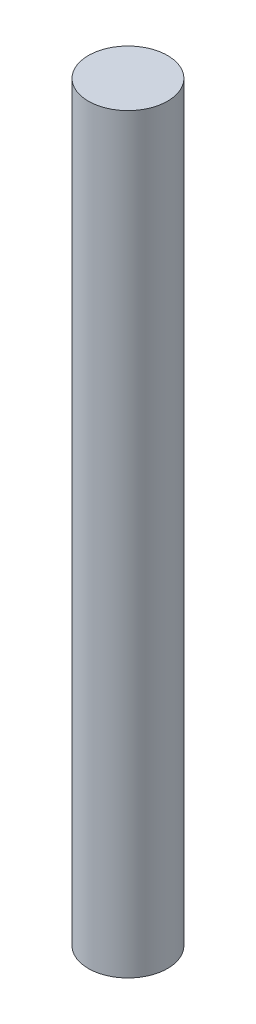
ISO-10303-21;
HEADER;
FILE_DESCRIPTION(('STEP AP214'),'2;1');
FILE_NAME('part.step','',(''),(''),'','','');
FILE_SCHEMA(('AUTOMOTIVE_DESIGN { 1 0 10303 214 1 1 1 1 }'));
ENDSEC;
DATA;
#1=APPLICATION_CONTEXT('core data for automotive mechanical design processes');
#2=APPLICATION_PROTOCOL_DEFINITION('international standard','automotive_design',2000,#1);
#3=PRODUCT_CONTEXT('',#1,'mechanical');
#4=PRODUCT('Part','Part','',(#3));
#5=PRODUCT_RELATED_PRODUCT_CATEGORY('part','',(#4));
#6=PRODUCT_DEFINITION_FORMATION('','',#4);
#7=PRODUCT_DEFINITION_CONTEXT('part definition',#1,'design');
#8=PRODUCT_DEFINITION('design','',#6,#7);
#9=PRODUCT_DEFINITION_SHAPE('','',#8);
#10=(LENGTH_UNIT() NAMED_UNIT(*) SI_UNIT(.MILLI.,.METRE.));
#11=(NAMED_UNIT(*) PLANE_ANGLE_UNIT() SI_UNIT($,.RADIAN.));
#12=(NAMED_UNIT(*) SI_UNIT($,.STERADIAN.) SOLID_ANGLE_UNIT());
#13=UNCERTAINTY_MEASURE_WITH_UNIT(LENGTH_MEASURE(1.E-05),#10,'distance_accuracy_value','');
#14=(GEOMETRIC_REPRESENTATION_CONTEXT(3) GLOBAL_UNCERTAINTY_ASSIGNED_CONTEXT((#13)) GLOBAL_UNIT_ASSIGNED_CONTEXT((#10,
#11,#12)) REPRESENTATION_CONTEXT('',''));
#15=CARTESIAN_POINT('',(0.,0.,0.));
#16=DIRECTION('',(0.,0.,1.));
#17=DIRECTION('',(1.,0.,0.));
#18=AXIS2_PLACEMENT_3D('',#15,#16,#17);
#19=CARTESIAN_POINT('',(0.,37.,0.));
#20=DIRECTION('',(0.,-1.,0.));
#21=DIRECTION('',(0.,0.,-1.));
#22=AXIS2_PLACEMENT_3D('',#19,#20,#21);
#23=CYLINDRICAL_SURFACE('',#22,1.95);
#24=CARTESIAN_POINT('',(0.,37.,0.));
#25=DIRECTION('',(0.,1.,0.));
#26=DIRECTION('',(0.,0.,1.));
#27=AXIS2_PLACEMENT_3D('',#24,#25,#26);
#28=CIRCLE('',#27,1.95);
#29=CARTESIAN_POINT('',(0.,37.,1.95));
#30=VERTEX_POINT('',#29);
#31=EDGE_CURVE('E10',#30,#30,#28,.T.);
#32=ORIENTED_EDGE('',*,*,#31,.F.);
#33=EDGE_LOOP('',(#32));
#34=FACE_BOUND('',#33,.T.);
#35=CARTESIAN_POINT('',(0.,0.,0.));
#36=DIRECTION('',(0.,1.,0.));
#37=DIRECTION('',(0.,0.,1.));
#38=AXIS2_PLACEMENT_3D('',#35,#36,#37);
#39=CIRCLE('',#38,1.95);
#40=CARTESIAN_POINT('',(0.,0.,1.95));
#41=VERTEX_POINT('',#40);
#42=EDGE_CURVE('E43',#41,#41,#39,.T.);
#43=ORIENTED_EDGE('',*,*,#42,.T.);
#44=EDGE_LOOP('',(#43));
#45=FACE_BOUND('',#44,.T.);
#46=ADVANCED_FACE('F40',(#34,#45),#23,.T.);
#47=CARTESIAN_POINT('',(0.,37.,0.));
#48=DIRECTION('',(0.,1.,0.));
#49=DIRECTION('',(0.,0.,1.));
#50=AXIS2_PLACEMENT_3D('',#47,#48,#49);
#51=PLANE('',#50);
#52=ORIENTED_EDGE('',*,*,#31,.T.);
#53=EDGE_LOOP('',(#52));
#54=FACE_BOUND('',#53,.T.);
#55=ADVANCED_FACE('F57',(#54),#51,.T.);
#56=CARTESIAN_POINT('',(0.,0.,0.));
#57=DIRECTION('',(0.,1.,0.));
#58=DIRECTION('',(0.,0.,1.));
#59=AXIS2_PLACEMENT_3D('',#56,#57,#58);
#60=PLANE('',#59);
#61=ORIENTED_EDGE('',*,*,#42,.F.);
#62=EDGE_LOOP('',(#61));
#63=FACE_BOUND('',#62,.T.);
#64=ADVANCED_FACE('F55',(#63),#60,.F.);
#65=CLOSED_SHELL('',(#46,#55,#64));
#66=MANIFOLD_SOLID_BREP('B2',#65);
#67=ADVANCED_BREP_SHAPE_REPRESENTATION('',(#18,#66),#14);
#68=SHAPE_DEFINITION_REPRESENTATION(#9,#67);
ENDSEC;
END-ISO-10303-21;
